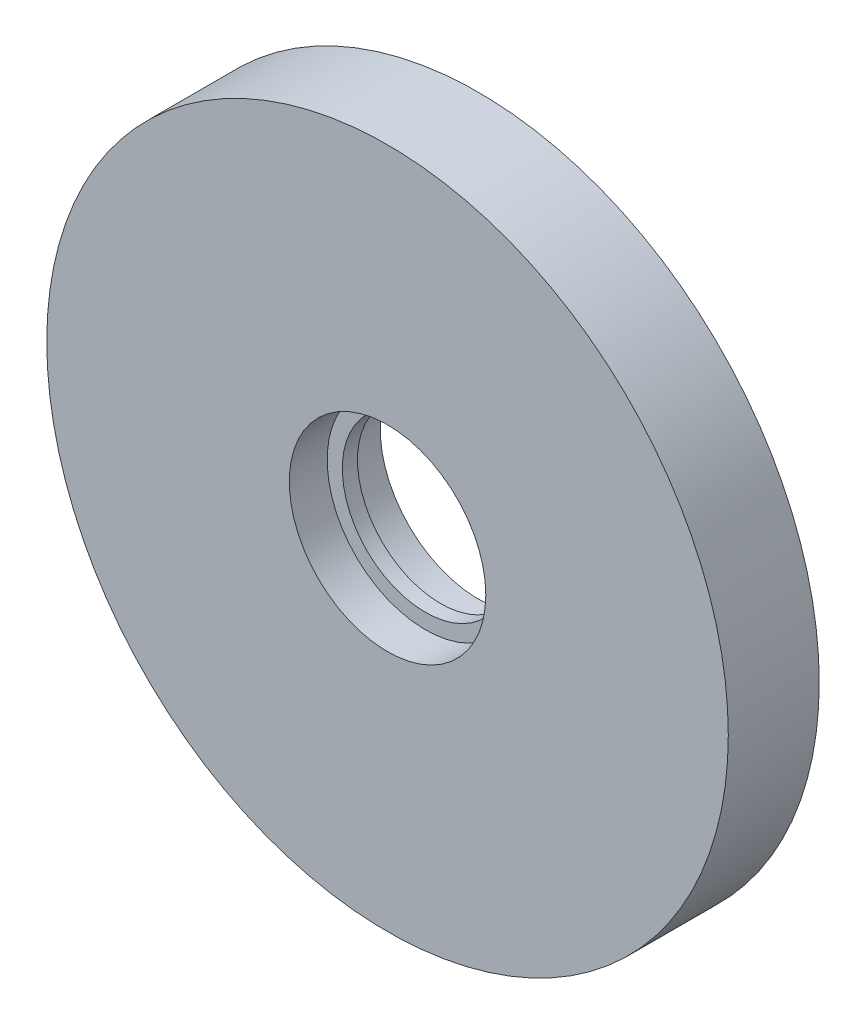
ISO-10303-21;
HEADER;
FILE_DESCRIPTION(('STEP AP214'),'2;1');
FILE_NAME('part.step','',(''),(''),'','','');
FILE_SCHEMA(('AUTOMOTIVE_DESIGN { 1 0 10303 214 1 1 1 1 }'));
ENDSEC;
DATA;
#1=APPLICATION_CONTEXT('core data for automotive mechanical design processes');
#2=APPLICATION_PROTOCOL_DEFINITION('international standard','automotive_design',2000,#1);
#3=PRODUCT_CONTEXT('',#1,'mechanical');
#4=PRODUCT('Part','Part','',(#3));
#5=PRODUCT_RELATED_PRODUCT_CATEGORY('part','',(#4));
#6=PRODUCT_DEFINITION_FORMATION('','',#4);
#7=PRODUCT_DEFINITION_CONTEXT('part definition',#1,'design');
#8=PRODUCT_DEFINITION('design','',#6,#7);
#9=PRODUCT_DEFINITION_SHAPE('','',#8);
#10=(LENGTH_UNIT() NAMED_UNIT(*) SI_UNIT(.MILLI.,.METRE.));
#11=(NAMED_UNIT(*) PLANE_ANGLE_UNIT() SI_UNIT($,.RADIAN.));
#12=(NAMED_UNIT(*) SI_UNIT($,.STERADIAN.) SOLID_ANGLE_UNIT());
#13=UNCERTAINTY_MEASURE_WITH_UNIT(LENGTH_MEASURE(1.E-05),#10,'distance_accuracy_value','');
#14=(GEOMETRIC_REPRESENTATION_CONTEXT(3) GLOBAL_UNCERTAINTY_ASSIGNED_CONTEXT((#13)) GLOBAL_UNIT_ASSIGNED_CONTEXT((#10,
#11,#12)) REPRESENTATION_CONTEXT('',''));
#15=CARTESIAN_POINT('',(0.,0.,0.));
#16=DIRECTION('',(0.,0.,1.));
#17=DIRECTION('',(1.,0.,0.));
#18=AXIS2_PLACEMENT_3D('',#15,#16,#17);
#19=CARTESIAN_POINT('',(-2.13964345572043,12.8129353792544,17.9055804628663));
#20=DIRECTION('',(0.,0.,1.));
#21=DIRECTION('',(1.,0.,0.));
#22=AXIS2_PLACEMENT_3D('',#19,#20,#21);
#23=CYLINDRICAL_SURFACE('',#22,33.725);
#24=CARTESIAN_POINT('',(-2.13964345572043,12.8129353792544,17.9055804628663));
#25=DIRECTION('',(0.,0.,1.));
#26=DIRECTION('',(1.,0.,0.));
#27=AXIS2_PLACEMENT_3D('',#24,#25,#26);
#28=CIRCLE('',#27,33.725);
#29=CARTESIAN_POINT('',(31.5853565442796,12.8129353792544,17.9055804628663));
#30=VERTEX_POINT('',#29);
#31=EDGE_CURVE('E56',#30,#30,#28,.T.);
#32=ORIENTED_EDGE('',*,*,#31,.T.);
#33=EDGE_LOOP('',(#32));
#34=FACE_BOUND('',#33,.T.);
#35=CARTESIAN_POINT('',(-2.13964345572043,12.8129353792544,26.9055804628663));
#36=DIRECTION('',(0.,0.,1.));
#37=DIRECTION('',(1.,0.,0.));
#38=AXIS2_PLACEMENT_3D('',#35,#36,#37);
#39=CIRCLE('',#38,33.725);
#40=CARTESIAN_POINT('',(31.5853565442796,12.8129353792544,26.9055804628663));
#41=VERTEX_POINT('',#40);
#42=EDGE_CURVE('E53',#41,#41,#39,.T.);
#43=ORIENTED_EDGE('',*,*,#42,.F.);
#44=EDGE_LOOP('',(#43));
#45=FACE_BOUND('',#44,.T.);
#46=ADVANCED_FACE('F33',(#34,#45),#23,.T.);
#47=CARTESIAN_POINT('',(-2.13964345572043,12.8129353792544,17.9055804628663));
#48=DIRECTION('',(0.,0.,1.));
#49=DIRECTION('',(1.,0.,0.));
#50=AXIS2_PLACEMENT_3D('',#47,#48,#49);
#51=PLANE('',#50);
#52=CARTESIAN_POINT('',(-2.13964345572043,12.8129353792544,17.9055804628663));
#53=DIRECTION('',(0.,0.,1.));
#54=DIRECTION('',(1.,0.,0.));
#55=AXIS2_PLACEMENT_3D('',#52,#53,#54);
#56=CIRCLE('',#55,9.725);
#57=CARTESIAN_POINT('',(7.58535654427957,12.8129353792544,17.9055804628663));
#58=VERTEX_POINT('',#57);
#59=EDGE_CURVE('E62',#58,#58,#56,.F.);
#60=ORIENTED_EDGE('',*,*,#59,.F.);
#61=EDGE_LOOP('',(#60));
#62=FACE_BOUND('',#61,.T.);
#63=ORIENTED_EDGE('',*,*,#31,.F.);
#64=EDGE_LOOP('',(#63));
#65=FACE_BOUND('',#64,.T.);
#66=ADVANCED_FACE('F35',(#62,#65),#51,.F.);
#67=CARTESIAN_POINT('',(-2.13964345572043,12.8129353792544,26.9055804628663));
#68=DIRECTION('',(0.,0.,1.));
#69=DIRECTION('',(1.,0.,0.));
#70=AXIS2_PLACEMENT_3D('',#67,#68,#69);
#71=PLANE('',#70);
#72=CARTESIAN_POINT('',(-2.13964345572043,12.8129353792544,26.9055804628663));
#73=DIRECTION('',(0.,0.,1.));
#74=DIRECTION('',(1.,0.,0.));
#75=AXIS2_PLACEMENT_3D('',#72,#73,#74);
#76=CIRCLE('',#75,9.725);
#77=CARTESIAN_POINT('',(7.58535654427957,12.8129353792544,26.9055804628663));
#78=VERTEX_POINT('',#77);
#79=EDGE_CURVE('E59',#78,#78,#76,.T.);
#80=ORIENTED_EDGE('',*,*,#79,.F.);
#81=EDGE_LOOP('',(#80));
#82=FACE_BOUND('',#81,.T.);
#83=ORIENTED_EDGE('',*,*,#42,.T.);
#84=EDGE_LOOP('',(#83));
#85=FACE_BOUND('',#84,.T.);
#86=ADVANCED_FACE('F70',(#82,#85),#71,.T.);
#87=CARTESIAN_POINT('',(-2.13964345572043,12.8129353792544,21.6555804628663));
#88=DIRECTION('',(0.,0.,-1.));
#89=DIRECTION('',(-1.,0.,0.));
#90=AXIS2_PLACEMENT_3D('',#87,#88,#89);
#91=CYLINDRICAL_SURFACE('',#90,9.725);
#92=CARTESIAN_POINT('',(-2.13964345572043,12.8129353792544,21.6555804628663));
#93=DIRECTION('',(0.,0.,1.));
#94=DIRECTION('',(1.,0.,0.));
#95=AXIS2_PLACEMENT_3D('',#92,#93,#94);
#96=CIRCLE('',#95,9.725);
#97=CARTESIAN_POINT('',(7.58535654427957,12.8129353792544,21.6555804628663));
#98=VERTEX_POINT('',#97);
#99=EDGE_CURVE('E48',#98,#98,#96,.T.);
#100=ORIENTED_EDGE('',*,*,#99,.T.);
#101=EDGE_LOOP('',(#100));
#102=FACE_BOUND('',#101,.T.);
#103=ORIENTED_EDGE('',*,*,#59,.T.);
#104=EDGE_LOOP('',(#103));
#105=FACE_BOUND('',#104,.T.);
#106=ADVANCED_FACE('F66',(#102,#105),#91,.F.);
#107=CARTESIAN_POINT('',(-2.13964345572043,12.8129353792544,21.6555804628663));
#108=DIRECTION('',(0.,0.,1.));
#109=DIRECTION('',(1.,0.,0.));
#110=AXIS2_PLACEMENT_3D('',#107,#108,#109);
#111=PLANE('',#110);
#112=CARTESIAN_POINT('',(-2.13964345572007,12.8129353792542,21.6555804628663));
#113=DIRECTION('',(0.,0.,1.));
#114=DIRECTION('',(1.,0.,0.));
#115=AXIS2_PLACEMENT_3D('',#112,#113,#114);
#116=CIRCLE('',#115,8.22499999999957);
#117=CARTESIAN_POINT('',(6.0853565442795,12.8129353792542,21.6555804628663));
#118=VERTEX_POINT('',#117);
#119=EDGE_CURVE('E44',#118,#118,#116,.T.);
#120=ORIENTED_EDGE('',*,*,#119,.T.);
#121=EDGE_LOOP('',(#120));
#122=FACE_BOUND('',#121,.T.);
#123=ORIENTED_EDGE('',*,*,#99,.F.);
#124=EDGE_LOOP('',(#123));
#125=FACE_BOUND('',#124,.T.);
#126=ADVANCED_FACE('F84',(#122,#125),#111,.F.);
#127=CARTESIAN_POINT('',(-2.13964345572007,12.8129353792542,23.1555804628663));
#128=DIRECTION('',(0.,0.,-1.));
#129=DIRECTION('',(-1.,0.,0.));
#130=AXIS2_PLACEMENT_3D('',#127,#128,#129);
#131=CYLINDRICAL_SURFACE('',#130,8.22499999999957);
#132=CARTESIAN_POINT('',(-2.13964345572007,12.8129353792542,23.1555804628663));
#133=DIRECTION('',(0.,0.,1.));
#134=DIRECTION('',(1.,0.,0.));
#135=AXIS2_PLACEMENT_3D('',#132,#133,#134);
#136=CIRCLE('',#135,8.22499999999957);
#137=CARTESIAN_POINT('',(6.0853565442795,12.8129353792542,23.1555804628663));
#138=VERTEX_POINT('',#137);
#139=EDGE_CURVE('E40',#138,#138,#136,.T.);
#140=ORIENTED_EDGE('',*,*,#139,.T.);
#141=EDGE_LOOP('',(#140));
#142=FACE_BOUND('',#141,.T.);
#143=ORIENTED_EDGE('',*,*,#119,.F.);
#144=EDGE_LOOP('',(#143));
#145=FACE_BOUND('',#144,.T.);
#146=ADVANCED_FACE('F91',(#142,#145),#131,.F.);
#147=CARTESIAN_POINT('',(-2.13964345572043,12.8129353792544,24.6555804628663));
#148=DIRECTION('',(0.,0.,-1.));
#149=DIRECTION('',(-1.,0.,0.));
#150=AXIS2_PLACEMENT_3D('',#147,#148,#149);
#151=CYLINDRICAL_SURFACE('',#150,9.725);
#152=CARTESIAN_POINT('',(-2.13964345572043,12.8129353792544,23.1555804628663));
#153=DIRECTION('',(0.,0.,1.));
#154=DIRECTION('',(1.,0.,0.));
#155=AXIS2_PLACEMENT_3D('',#152,#153,#154);
#156=CIRCLE('',#155,9.725);
#157=CARTESIAN_POINT('',(7.58535654427957,12.8129353792544,23.1555804628663));
#158=VERTEX_POINT('',#157);
#159=EDGE_CURVE('E10',#158,#158,#156,.T.);
#160=ORIENTED_EDGE('',*,*,#159,.F.);
#161=EDGE_LOOP('',(#160));
#162=FACE_BOUND('',#161,.T.);
#163=ORIENTED_EDGE('',*,*,#79,.T.);
#164=EDGE_LOOP('',(#163));
#165=FACE_BOUND('',#164,.T.);
#166=ADVANCED_FACE('F95',(#162,#165),#151,.F.);
#167=CARTESIAN_POINT('',(-2.13964345572043,12.8129353792544,23.1555804628663));
#168=DIRECTION('',(0.,0.,1.));
#169=DIRECTION('',(1.,0.,0.));
#170=AXIS2_PLACEMENT_3D('',#167,#168,#169);
#171=PLANE('',#170);
#172=ORIENTED_EDGE('',*,*,#139,.F.);
#173=EDGE_LOOP('',(#172));
#174=FACE_BOUND('',#173,.T.);
#175=ORIENTED_EDGE('',*,*,#159,.T.);
#176=EDGE_LOOP('',(#175));
#177=FACE_BOUND('',#176,.T.);
#178=ADVANCED_FACE('F97',(#174,#177),#171,.T.);
#179=CLOSED_SHELL('',(#46,#66,#86,#106,#126,#146,#166,#178));
#180=MANIFOLD_SOLID_BREP('B2',#179);
#181=ADVANCED_BREP_SHAPE_REPRESENTATION('',(#18,#180),#14);
#182=SHAPE_DEFINITION_REPRESENTATION(#9,#181);
ENDSEC;
END-ISO-10303-21;
